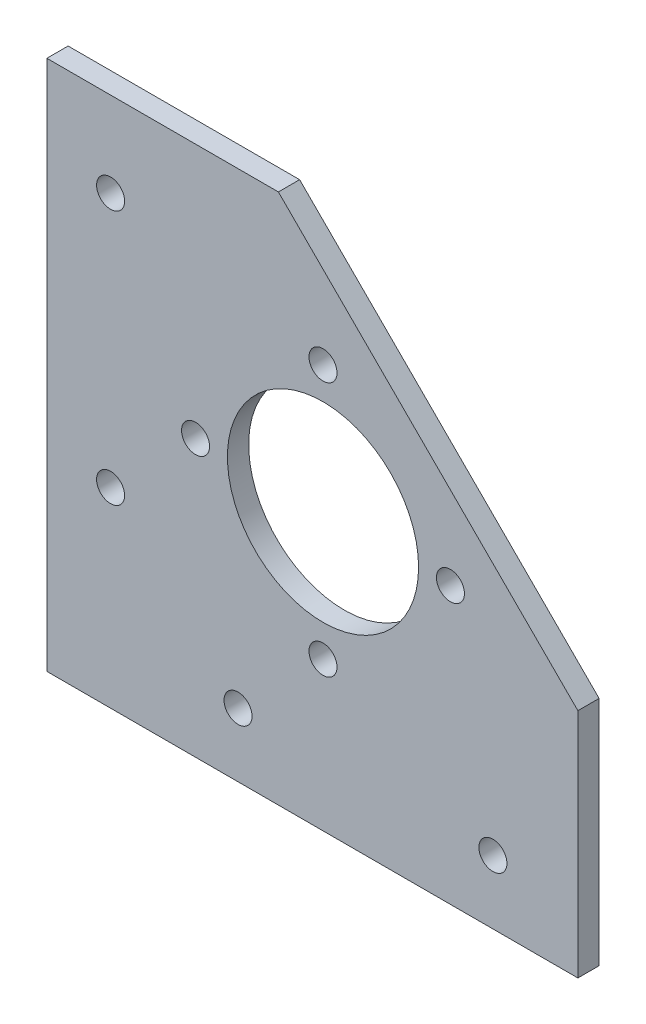
ISO-10303-21;
HEADER;
FILE_DESCRIPTION(('STEP AP214'),'2;1');
FILE_NAME('part.step','',(''),(''),'','','');
FILE_SCHEMA(('AUTOMOTIVE_DESIGN { 1 0 10303 214 1 1 1 1 }'));
ENDSEC;
DATA;
#1=APPLICATION_CONTEXT('core data for automotive mechanical design processes');
#2=APPLICATION_PROTOCOL_DEFINITION('international standard','automotive_design',2000,#1);
#3=PRODUCT_CONTEXT('',#1,'mechanical');
#4=PRODUCT('Part','Part','',(#3));
#5=PRODUCT_RELATED_PRODUCT_CATEGORY('part','',(#4));
#6=PRODUCT_DEFINITION_FORMATION('','',#4);
#7=PRODUCT_DEFINITION_CONTEXT('part definition',#1,'design');
#8=PRODUCT_DEFINITION('design','',#6,#7);
#9=PRODUCT_DEFINITION_SHAPE('','',#8);
#10=(LENGTH_UNIT() NAMED_UNIT(*) SI_UNIT(.MILLI.,.METRE.));
#11=(NAMED_UNIT(*) PLANE_ANGLE_UNIT() SI_UNIT($,.RADIAN.));
#12=(NAMED_UNIT(*) SI_UNIT($,.STERADIAN.) SOLID_ANGLE_UNIT());
#13=UNCERTAINTY_MEASURE_WITH_UNIT(LENGTH_MEASURE(1.E-05),#10,'distance_accuracy_value','');
#14=(GEOMETRIC_REPRESENTATION_CONTEXT(3) GLOBAL_UNCERTAINTY_ASSIGNED_CONTEXT((#13)) GLOBAL_UNIT_ASSIGNED_CONTEXT((#10,
#11,#12)) REPRESENTATION_CONTEXT('',''));
#15=CARTESIAN_POINT('',(0.,0.,0.));
#16=DIRECTION('',(0.,0.,1.));
#17=DIRECTION('',(1.,0.,0.));
#18=AXIS2_PLACEMENT_3D('',#15,#16,#17);
#19=CARTESIAN_POINT('',(125.,-75.1414213562373,5.));
#20=DIRECTION('',(1.,0.,0.));
#21=DIRECTION('',(0.,0.,-1.));
#22=AXIS2_PLACEMENT_3D('',#19,#20,#21);
#23=PLANE('',#22);
#24=DIRECTION('',(0.,-1.,0.));
#25=VECTOR('',#24,1.);
#26=CARTESIAN_POINT('',(125.,-75.1414213562373,0.));
#27=LINE('',#26,#25);
#28=CARTESIAN_POINT('',(125.,54.4974746830583,0.));
#29=VERTEX_POINT('',#28);
#30=CARTESIAN_POINT('',(125.,0.,0.));
#31=VERTEX_POINT('',#30);
#32=EDGE_CURVE('E115',#29,#31,#27,.T.);
#33=ORIENTED_EDGE('',*,*,#32,.F.);
#34=DIRECTION('',(0.,0.,-1.));
#35=VECTOR('',#34,1.);
#36=CARTESIAN_POINT('',(125.,54.4974746830583,5.));
#37=LINE('',#36,#35);
#38=CARTESIAN_POINT('',(125.,54.4974746830583,5.));
#39=VERTEX_POINT('',#38);
#40=EDGE_CURVE('E11',#39,#29,#37,.T.);
#41=ORIENTED_EDGE('',*,*,#40,.F.);
#42=DIRECTION('',(0.,-1.,0.));
#43=VECTOR('',#42,1.);
#44=CARTESIAN_POINT('',(125.,-75.1414213562373,5.));
#45=LINE('',#44,#43);
#46=CARTESIAN_POINT('',(125.,0.,5.));
#47=VERTEX_POINT('',#46);
#48=EDGE_CURVE('E317',#39,#47,#45,.T.);
#49=ORIENTED_EDGE('',*,*,#48,.T.);
#50=DIRECTION('',(0.,0.,-1.));
#51=VECTOR('',#50,1.);
#52=CARTESIAN_POINT('',(125.,0.,5.));
#53=LINE('',#52,#51);
#54=EDGE_CURVE('E55',#47,#31,#53,.T.);
#55=ORIENTED_EDGE('',*,*,#54,.T.);
#56=EDGE_LOOP('',(#33,#41,#49,#55));
#57=FACE_BOUND('',#56,.T.);
#58=ADVANCED_FACE('F38',(#57),#23,.T.);
#59=CARTESIAN_POINT('',(158.569448019648,20.9280266634105,5.));
#60=DIRECTION('',(0.707106781186548,0.707106781186548,0.));
#61=DIRECTION('',(-0.707106781186548,0.707106781186548,0.));
#62=AXIS2_PLACEMENT_3D('',#59,#60,#61);
#63=PLANE('',#62);
#64=DIRECTION('',(0.707106781186548,-0.707106781186548,0.));
#65=VECTOR('',#64,1.);
#66=CARTESIAN_POINT('',(158.569448019648,20.9280266634105,0.));
#67=LINE('',#66,#65);
#68=CARTESIAN_POINT('',(54.4974746830583,125.,0.));
#69=VERTEX_POINT('',#68);
#70=EDGE_CURVE('E118',#69,#29,#67,.T.);
#71=ORIENTED_EDGE('',*,*,#70,.F.);
#72=DIRECTION('',(0.,0.,-1.));
#73=VECTOR('',#72,1.);
#74=CARTESIAN_POINT('',(54.4974746830583,125.,5.));
#75=LINE('',#74,#73);
#76=CARTESIAN_POINT('',(54.4974746830583,125.,5.));
#77=VERTEX_POINT('',#76);
#78=EDGE_CURVE('E47',#77,#69,#75,.T.);
#79=ORIENTED_EDGE('',*,*,#78,.F.);
#80=DIRECTION('',(0.707106781186548,-0.707106781186548,0.));
#81=VECTOR('',#80,1.);
#82=CARTESIAN_POINT('',(158.569448019648,20.9280266634105,5.));
#83=LINE('',#82,#81);
#84=EDGE_CURVE('E104',#77,#39,#83,.T.);
#85=ORIENTED_EDGE('',*,*,#84,.T.);
#86=ORIENTED_EDGE('',*,*,#40,.T.);
#87=EDGE_LOOP('',(#71,#79,#85,#86));
#88=FACE_BOUND('',#87,.T.);
#89=ADVANCED_FACE('F131',(#88),#63,.T.);
#90=CARTESIAN_POINT('',(62.5,125.,5.));
#91=DIRECTION('',(0.,1.,0.));
#92=DIRECTION('',(0.,0.,1.));
#93=AXIS2_PLACEMENT_3D('',#90,#91,#92);
#94=PLANE('',#93);
#95=DIRECTION('',(1.,0.,0.));
#96=VECTOR('',#95,1.);
#97=CARTESIAN_POINT('',(62.5,125.,0.));
#98=LINE('',#97,#96);
#99=CARTESIAN_POINT('',(0.,125.,0.));
#100=VERTEX_POINT('',#99);
#101=EDGE_CURVE('E92',#100,#69,#98,.T.);
#102=ORIENTED_EDGE('',*,*,#101,.F.);
#103=DIRECTION('',(0.,0.,-1.));
#104=VECTOR('',#103,1.);
#105=CARTESIAN_POINT('',(0.,125.,5.));
#106=LINE('',#105,#104);
#107=CARTESIAN_POINT('',(0.,125.,5.));
#108=VERTEX_POINT('',#107);
#109=EDGE_CURVE('E87',#108,#100,#106,.T.);
#110=ORIENTED_EDGE('',*,*,#109,.F.);
#111=DIRECTION('',(1.,0.,0.));
#112=VECTOR('',#111,1.);
#113=CARTESIAN_POINT('',(62.5,125.,5.));
#114=LINE('',#113,#112);
#115=EDGE_CURVE('E90',#108,#77,#114,.T.);
#116=ORIENTED_EDGE('',*,*,#115,.T.);
#117=ORIENTED_EDGE('',*,*,#78,.T.);
#118=EDGE_LOOP('',(#102,#110,#116,#117));
#119=FACE_BOUND('',#118,.T.);
#120=ADVANCED_FACE('F89',(#119),#94,.T.);
#121=CARTESIAN_POINT('',(0.,-75.1414213562373,5.));
#122=DIRECTION('',(-1.,0.,0.));
#123=DIRECTION('',(0.,0.,1.));
#124=AXIS2_PLACEMENT_3D('',#121,#122,#123);
#125=PLANE('',#124);
#126=DIRECTION('',(0.,1.,0.));
#127=VECTOR('',#126,1.);
#128=CARTESIAN_POINT('',(0.,-75.1414213562373,0.));
#129=LINE('',#128,#127);
#130=CARTESIAN_POINT('',(0.,0.,0.));
#131=VERTEX_POINT('',#130);
#132=EDGE_CURVE('E122',#131,#100,#129,.T.);
#133=ORIENTED_EDGE('',*,*,#132,.F.);
#134=DIRECTION('',(0.,0.,-1.));
#135=VECTOR('',#134,1.);
#136=CARTESIAN_POINT('',(0.,0.,5.));
#137=LINE('',#136,#135);
#138=CARTESIAN_POINT('',(0.,0.,5.));
#139=VERTEX_POINT('',#138);
#140=EDGE_CURVE('E71',#139,#131,#137,.T.);
#141=ORIENTED_EDGE('',*,*,#140,.F.);
#142=DIRECTION('',(0.,1.,0.));
#143=VECTOR('',#142,1.);
#144=CARTESIAN_POINT('',(0.,-75.1414213562373,5.));
#145=LINE('',#144,#143);
#146=EDGE_CURVE('E102',#139,#108,#145,.T.);
#147=ORIENTED_EDGE('',*,*,#146,.T.);
#148=ORIENTED_EDGE('',*,*,#109,.T.);
#149=EDGE_LOOP('',(#133,#141,#147,#148));
#150=FACE_BOUND('',#149,.T.);
#151=ADVANCED_FACE('F106',(#150),#125,.T.);
#152=CARTESIAN_POINT('',(65.,65.,5.));
#153=DIRECTION('',(0.,0.,-1.));
#154=DIRECTION('',(-1.,0.,0.));
#155=AXIS2_PLACEMENT_3D('',#152,#153,#154);
#156=CYLINDRICAL_SURFACE('',#155,22.5);
#157=CARTESIAN_POINT('',(65.,65.,5.));
#158=DIRECTION('',(0.,0.,1.));
#159=DIRECTION('',(1.,0.,0.));
#160=AXIS2_PLACEMENT_3D('',#157,#158,#159);
#161=CIRCLE('',#160,22.5);
#162=CARTESIAN_POINT('',(87.5,65.,5.));
#163=VERTEX_POINT('',#162);
#164=EDGE_CURVE('E127',#163,#163,#161,.T.);
#165=ORIENTED_EDGE('',*,*,#164,.T.);
#166=EDGE_LOOP('',(#165));
#167=FACE_BOUND('',#166,.T.);
#168=CARTESIAN_POINT('',(65.,65.,0.));
#169=DIRECTION('',(0.,0.,1.));
#170=DIRECTION('',(1.,0.,0.));
#171=AXIS2_PLACEMENT_3D('',#168,#169,#170);
#172=CIRCLE('',#171,22.5);
#173=CARTESIAN_POINT('',(87.5,65.,0.));
#174=VERTEX_POINT('',#173);
#175=EDGE_CURVE('E112',#174,#174,#172,.T.);
#176=ORIENTED_EDGE('',*,*,#175,.F.);
#177=EDGE_LOOP('',(#176));
#178=FACE_BOUND('',#177,.T.);
#179=ADVANCED_FACE('F40',(#167,#178),#156,.F.);
#180=CARTESIAN_POINT('',(62.5,0.,5.));
#181=DIRECTION('',(0.,-1.,0.));
#182=DIRECTION('',(0.,0.,-1.));
#183=AXIS2_PLACEMENT_3D('',#180,#181,#182);
#184=PLANE('',#183);
#185=DIRECTION('',(-1.,0.,0.));
#186=VECTOR('',#185,1.);
#187=CARTESIAN_POINT('',(62.5,0.,0.));
#188=LINE('',#187,#186);
#189=EDGE_CURVE('E124',#31,#131,#188,.T.);
#190=ORIENTED_EDGE('',*,*,#189,.F.);
#191=ORIENTED_EDGE('',*,*,#54,.F.);
#192=DIRECTION('',(-1.,0.,0.));
#193=VECTOR('',#192,1.);
#194=CARTESIAN_POINT('',(62.5,0.,5.));
#195=LINE('',#194,#193);
#196=EDGE_CURVE('E107',#47,#139,#195,.T.);
#197=ORIENTED_EDGE('',*,*,#196,.T.);
#198=ORIENTED_EDGE('',*,*,#140,.T.);
#199=EDGE_LOOP('',(#190,#191,#197,#198));
#200=FACE_BOUND('',#199,.T.);
#201=ADVANCED_FACE('F134',(#200),#184,.T.);
#202=CARTESIAN_POINT('',(62.5,-75.1414213562373,5.));
#203=DIRECTION('',(0.,0.,1.));
#204=DIRECTION('',(1.,0.,0.));
#205=AXIS2_PLACEMENT_3D('',#202,#203,#204);
#206=PLANE('',#205);
#207=CARTESIAN_POINT('',(95.,65.,5.));
#208=DIRECTION('',(0.,0.,1.));
#209=DIRECTION('',(1.,0.,0.));
#210=AXIS2_PLACEMENT_3D('',#207,#208,#209);
#211=CIRCLE('',#210,3.3);
#212=CARTESIAN_POINT('',(98.3,65.,5.));
#213=VERTEX_POINT('',#212);
#214=EDGE_CURVE('E267',#213,#213,#211,.T.);
#215=ORIENTED_EDGE('',*,*,#214,.F.);
#216=EDGE_LOOP('',(#215));
#217=FACE_BOUND('',#216,.T.);
#218=CARTESIAN_POINT('',(65.,95.,5.));
#219=DIRECTION('',(0.,0.,1.));
#220=DIRECTION('',(1.,0.,0.));
#221=AXIS2_PLACEMENT_3D('',#218,#219,#220);
#222=CIRCLE('',#221,3.3);
#223=CARTESIAN_POINT('',(68.3,95.,5.));
#224=VERTEX_POINT('',#223);
#225=EDGE_CURVE('E277',#224,#224,#222,.T.);
#226=ORIENTED_EDGE('',*,*,#225,.F.);
#227=EDGE_LOOP('',(#226));
#228=FACE_BOUND('',#227,.T.);
#229=CARTESIAN_POINT('',(35.,65.,5.));
#230=DIRECTION('',(0.,0.,1.));
#231=DIRECTION('',(1.,0.,0.));
#232=AXIS2_PLACEMENT_3D('',#229,#230,#231);
#233=CIRCLE('',#232,3.3);
#234=CARTESIAN_POINT('',(38.3,65.,5.));
#235=VERTEX_POINT('',#234);
#236=EDGE_CURVE('E283',#235,#235,#233,.T.);
#237=ORIENTED_EDGE('',*,*,#236,.F.);
#238=EDGE_LOOP('',(#237));
#239=FACE_BOUND('',#238,.T.);
#240=CARTESIAN_POINT('',(65.,35.,5.));
#241=DIRECTION('',(0.,0.,1.));
#242=DIRECTION('',(1.,0.,0.));
#243=AXIS2_PLACEMENT_3D('',#240,#241,#242);
#244=CIRCLE('',#243,3.3);
#245=CARTESIAN_POINT('',(68.3,35.,5.));
#246=VERTEX_POINT('',#245);
#247=EDGE_CURVE('E289',#246,#246,#244,.T.);
#248=ORIENTED_EDGE('',*,*,#247,.F.);
#249=EDGE_LOOP('',(#248));
#250=FACE_BOUND('',#249,.T.);
#251=CARTESIAN_POINT('',(105.,15.,5.));
#252=DIRECTION('',(0.,0.,1.));
#253=DIRECTION('',(1.,0.,0.));
#254=AXIS2_PLACEMENT_3D('',#251,#252,#253);
#255=CIRCLE('',#254,3.3);
#256=CARTESIAN_POINT('',(108.3,15.,5.));
#257=VERTEX_POINT('',#256);
#258=EDGE_CURVE('E295',#257,#257,#255,.T.);
#259=ORIENTED_EDGE('',*,*,#258,.F.);
#260=EDGE_LOOP('',(#259));
#261=FACE_BOUND('',#260,.T.);
#262=CARTESIAN_POINT('',(45.,15.,5.));
#263=DIRECTION('',(0.,0.,1.));
#264=DIRECTION('',(1.,0.,0.));
#265=AXIS2_PLACEMENT_3D('',#262,#263,#264);
#266=CIRCLE('',#265,3.3);
#267=CARTESIAN_POINT('',(48.3,15.,5.));
#268=VERTEX_POINT('',#267);
#269=EDGE_CURVE('E301',#268,#268,#266,.T.);
#270=ORIENTED_EDGE('',*,*,#269,.F.);
#271=EDGE_LOOP('',(#270));
#272=FACE_BOUND('',#271,.T.);
#273=CARTESIAN_POINT('',(15.,45.,5.));
#274=DIRECTION('',(0.,0.,1.));
#275=DIRECTION('',(1.,0.,0.));
#276=AXIS2_PLACEMENT_3D('',#273,#274,#275);
#277=CIRCLE('',#276,3.3);
#278=CARTESIAN_POINT('',(18.3,45.,5.));
#279=VERTEX_POINT('',#278);
#280=EDGE_CURVE('E307',#279,#279,#277,.T.);
#281=ORIENTED_EDGE('',*,*,#280,.F.);
#282=EDGE_LOOP('',(#281));
#283=FACE_BOUND('',#282,.T.);
#284=CARTESIAN_POINT('',(15.,105.,5.));
#285=DIRECTION('',(0.,0.,1.));
#286=DIRECTION('',(1.,0.,0.));
#287=AXIS2_PLACEMENT_3D('',#284,#285,#286);
#288=CIRCLE('',#287,3.3);
#289=CARTESIAN_POINT('',(18.3,105.,5.));
#290=VERTEX_POINT('',#289);
#291=EDGE_CURVE('E116',#290,#290,#288,.T.);
#292=ORIENTED_EDGE('',*,*,#291,.F.);
#293=EDGE_LOOP('',(#292));
#294=FACE_BOUND('',#293,.T.);
#295=ORIENTED_EDGE('',*,*,#164,.F.);
#296=EDGE_LOOP('',(#295));
#297=FACE_BOUND('',#296,.T.);
#298=ORIENTED_EDGE('',*,*,#48,.F.);
#299=ORIENTED_EDGE('',*,*,#84,.F.);
#300=ORIENTED_EDGE('',*,*,#115,.F.);
#301=ORIENTED_EDGE('',*,*,#146,.F.);
#302=ORIENTED_EDGE('',*,*,#196,.F.);
#303=EDGE_LOOP('',(#298,#299,#300,#301,#302));
#304=FACE_BOUND('',#303,.T.);
#305=ADVANCED_FACE('F100',(#217,#228,#239,#250,#261,#272,#283,#294,#297,#304),#206,.T.);
#306=CARTESIAN_POINT('',(62.5,-75.1414213562373,0.));
#307=DIRECTION('',(0.,0.,1.));
#308=DIRECTION('',(1.,0.,0.));
#309=AXIS2_PLACEMENT_3D('',#306,#307,#308);
#310=PLANE('',#309);
#311=CARTESIAN_POINT('',(95.,65.,0.));
#312=DIRECTION('',(0.,0.,-1.));
#313=DIRECTION('',(-1.,0.,0.));
#314=AXIS2_PLACEMENT_3D('',#311,#312,#313);
#315=CIRCLE('',#314,3.3);
#316=CARTESIAN_POINT('',(91.7,65.,0.));
#317=VERTEX_POINT('',#316);
#318=EDGE_CURVE('E270',#317,#317,#315,.T.);
#319=ORIENTED_EDGE('',*,*,#318,.F.);
#320=EDGE_LOOP('',(#319));
#321=FACE_BOUND('',#320,.T.);
#322=CARTESIAN_POINT('',(65.,95.,0.));
#323=DIRECTION('',(0.,0.,-1.));
#324=DIRECTION('',(-1.,0.,0.));
#325=AXIS2_PLACEMENT_3D('',#322,#323,#324);
#326=CIRCLE('',#325,3.3);
#327=CARTESIAN_POINT('',(61.7,95.,0.));
#328=VERTEX_POINT('',#327);
#329=EDGE_CURVE('E272',#328,#328,#326,.T.);
#330=ORIENTED_EDGE('',*,*,#329,.F.);
#331=EDGE_LOOP('',(#330));
#332=FACE_BOUND('',#331,.T.);
#333=CARTESIAN_POINT('',(35.,65.,0.));
#334=DIRECTION('',(0.,0.,-1.));
#335=DIRECTION('',(-1.,0.,0.));
#336=AXIS2_PLACEMENT_3D('',#333,#334,#335);
#337=CIRCLE('',#336,3.3);
#338=CARTESIAN_POINT('',(31.7,65.,0.));
#339=VERTEX_POINT('',#338);
#340=EDGE_CURVE('E280',#339,#339,#337,.T.);
#341=ORIENTED_EDGE('',*,*,#340,.F.);
#342=EDGE_LOOP('',(#341));
#343=FACE_BOUND('',#342,.T.);
#344=CARTESIAN_POINT('',(65.,35.,0.));
#345=DIRECTION('',(0.,0.,-1.));
#346=DIRECTION('',(-1.,0.,0.));
#347=AXIS2_PLACEMENT_3D('',#344,#345,#346);
#348=CIRCLE('',#347,3.3);
#349=CARTESIAN_POINT('',(61.7,35.,0.));
#350=VERTEX_POINT('',#349);
#351=EDGE_CURVE('E286',#350,#350,#348,.T.);
#352=ORIENTED_EDGE('',*,*,#351,.F.);
#353=EDGE_LOOP('',(#352));
#354=FACE_BOUND('',#353,.T.);
#355=CARTESIAN_POINT('',(105.,15.,0.));
#356=DIRECTION('',(0.,0.,-1.));
#357=DIRECTION('',(-1.,0.,0.));
#358=AXIS2_PLACEMENT_3D('',#355,#356,#357);
#359=CIRCLE('',#358,3.3);
#360=CARTESIAN_POINT('',(101.7,15.,0.));
#361=VERTEX_POINT('',#360);
#362=EDGE_CURVE('E292',#361,#361,#359,.T.);
#363=ORIENTED_EDGE('',*,*,#362,.F.);
#364=EDGE_LOOP('',(#363));
#365=FACE_BOUND('',#364,.T.);
#366=CARTESIAN_POINT('',(45.,15.,0.));
#367=DIRECTION('',(0.,0.,-1.));
#368=DIRECTION('',(-1.,0.,0.));
#369=AXIS2_PLACEMENT_3D('',#366,#367,#368);
#370=CIRCLE('',#369,3.3);
#371=CARTESIAN_POINT('',(41.7,15.,0.));
#372=VERTEX_POINT('',#371);
#373=EDGE_CURVE('E298',#372,#372,#370,.T.);
#374=ORIENTED_EDGE('',*,*,#373,.F.);
#375=EDGE_LOOP('',(#374));
#376=FACE_BOUND('',#375,.T.);
#377=CARTESIAN_POINT('',(15.,45.,0.));
#378=DIRECTION('',(0.,0.,-1.));
#379=DIRECTION('',(-1.,0.,0.));
#380=AXIS2_PLACEMENT_3D('',#377,#378,#379);
#381=CIRCLE('',#380,3.3);
#382=CARTESIAN_POINT('',(11.7,45.,0.));
#383=VERTEX_POINT('',#382);
#384=EDGE_CURVE('E304',#383,#383,#381,.T.);
#385=ORIENTED_EDGE('',*,*,#384,.F.);
#386=EDGE_LOOP('',(#385));
#387=FACE_BOUND('',#386,.T.);
#388=CARTESIAN_POINT('',(15.,105.,0.));
#389=DIRECTION('',(0.,0.,-1.));
#390=DIRECTION('',(-1.,0.,0.));
#391=AXIS2_PLACEMENT_3D('',#388,#389,#390);
#392=CIRCLE('',#391,3.3);
#393=CARTESIAN_POINT('',(11.7,105.,0.));
#394=VERTEX_POINT('',#393);
#395=EDGE_CURVE('E310',#394,#394,#392,.T.);
#396=ORIENTED_EDGE('',*,*,#395,.F.);
#397=EDGE_LOOP('',(#396));
#398=FACE_BOUND('',#397,.T.);
#399=ORIENTED_EDGE('',*,*,#175,.T.);
#400=EDGE_LOOP('',(#399));
#401=FACE_BOUND('',#400,.T.);
#402=ORIENTED_EDGE('',*,*,#32,.T.);
#403=ORIENTED_EDGE('',*,*,#189,.T.);
#404=ORIENTED_EDGE('',*,*,#132,.T.);
#405=ORIENTED_EDGE('',*,*,#101,.T.);
#406=ORIENTED_EDGE('',*,*,#70,.T.);
#407=EDGE_LOOP('',(#402,#403,#404,#405,#406));
#408=FACE_BOUND('',#407,.T.);
#409=ADVANCED_FACE('F133',(#321,#332,#343,#354,#365,#376,#387,#398,#401,#408),#310,.F.);
#410=CARTESIAN_POINT('',(15.,105.,0.));
#411=DIRECTION('',(0.,0.,-1.));
#412=DIRECTION('',(-1.,0.,0.));
#413=AXIS2_PLACEMENT_3D('',#410,#411,#412);
#414=CYLINDRICAL_SURFACE('',#413,3.3);
#415=ORIENTED_EDGE('',*,*,#291,.T.);
#416=EDGE_LOOP('',(#415));
#417=FACE_BOUND('',#416,.T.);
#418=ORIENTED_EDGE('',*,*,#395,.T.);
#419=EDGE_LOOP('',(#418));
#420=FACE_BOUND('',#419,.T.);
#421=ADVANCED_FACE('F181',(#417,#420),#414,.F.);
#422=CARTESIAN_POINT('',(15.,45.,0.));
#423=DIRECTION('',(0.,0.,-1.));
#424=DIRECTION('',(-1.,0.,0.));
#425=AXIS2_PLACEMENT_3D('',#422,#423,#424);
#426=CYLINDRICAL_SURFACE('',#425,3.3);
#427=ORIENTED_EDGE('',*,*,#280,.T.);
#428=EDGE_LOOP('',(#427));
#429=FACE_BOUND('',#428,.T.);
#430=ORIENTED_EDGE('',*,*,#384,.T.);
#431=EDGE_LOOP('',(#430));
#432=FACE_BOUND('',#431,.T.);
#433=ADVANCED_FACE('F190',(#429,#432),#426,.F.);
#434=CARTESIAN_POINT('',(45.,15.,0.));
#435=DIRECTION('',(0.,0.,-1.));
#436=DIRECTION('',(-1.,0.,0.));
#437=AXIS2_PLACEMENT_3D('',#434,#435,#436);
#438=CYLINDRICAL_SURFACE('',#437,3.3);
#439=ORIENTED_EDGE('',*,*,#269,.T.);
#440=EDGE_LOOP('',(#439));
#441=FACE_BOUND('',#440,.T.);
#442=ORIENTED_EDGE('',*,*,#373,.T.);
#443=EDGE_LOOP('',(#442));
#444=FACE_BOUND('',#443,.T.);
#445=ADVANCED_FACE('F200',(#441,#444),#438,.F.);
#446=CARTESIAN_POINT('',(105.,15.,0.));
#447=DIRECTION('',(0.,0.,-1.));
#448=DIRECTION('',(-1.,0.,0.));
#449=AXIS2_PLACEMENT_3D('',#446,#447,#448);
#450=CYLINDRICAL_SURFACE('',#449,3.3);
#451=ORIENTED_EDGE('',*,*,#258,.T.);
#452=EDGE_LOOP('',(#451));
#453=FACE_BOUND('',#452,.T.);
#454=ORIENTED_EDGE('',*,*,#362,.T.);
#455=EDGE_LOOP('',(#454));
#456=FACE_BOUND('',#455,.T.);
#457=ADVANCED_FACE('F210',(#453,#456),#450,.F.);
#458=CARTESIAN_POINT('',(65.,35.,0.));
#459=DIRECTION('',(0.,0.,-1.));
#460=DIRECTION('',(-1.,0.,0.));
#461=AXIS2_PLACEMENT_3D('',#458,#459,#460);
#462=CYLINDRICAL_SURFACE('',#461,3.3);
#463=ORIENTED_EDGE('',*,*,#247,.T.);
#464=EDGE_LOOP('',(#463));
#465=FACE_BOUND('',#464,.T.);
#466=ORIENTED_EDGE('',*,*,#351,.T.);
#467=EDGE_LOOP('',(#466));
#468=FACE_BOUND('',#467,.T.);
#469=ADVANCED_FACE('F220',(#465,#468),#462,.F.);
#470=CARTESIAN_POINT('',(35.,65.,0.));
#471=DIRECTION('',(0.,0.,-1.));
#472=DIRECTION('',(-1.,0.,0.));
#473=AXIS2_PLACEMENT_3D('',#470,#471,#472);
#474=CYLINDRICAL_SURFACE('',#473,3.3);
#475=ORIENTED_EDGE('',*,*,#236,.T.);
#476=EDGE_LOOP('',(#475));
#477=FACE_BOUND('',#476,.T.);
#478=ORIENTED_EDGE('',*,*,#340,.T.);
#479=EDGE_LOOP('',(#478));
#480=FACE_BOUND('',#479,.T.);
#481=ADVANCED_FACE('F230',(#477,#480),#474,.F.);
#482=CARTESIAN_POINT('',(65.,95.,0.));
#483=DIRECTION('',(0.,0.,-1.));
#484=DIRECTION('',(-1.,0.,0.));
#485=AXIS2_PLACEMENT_3D('',#482,#483,#484);
#486=CYLINDRICAL_SURFACE('',#485,3.3);
#487=ORIENTED_EDGE('',*,*,#225,.T.);
#488=EDGE_LOOP('',(#487));
#489=FACE_BOUND('',#488,.T.);
#490=ORIENTED_EDGE('',*,*,#329,.T.);
#491=EDGE_LOOP('',(#490));
#492=FACE_BOUND('',#491,.T.);
#493=ADVANCED_FACE('F240',(#489,#492),#486,.F.);
#494=CARTESIAN_POINT('',(95.,65.,0.));
#495=DIRECTION('',(0.,0.,-1.));
#496=DIRECTION('',(-1.,0.,0.));
#497=AXIS2_PLACEMENT_3D('',#494,#495,#496);
#498=CYLINDRICAL_SURFACE('',#497,3.3);
#499=ORIENTED_EDGE('',*,*,#214,.T.);
#500=EDGE_LOOP('',(#499));
#501=FACE_BOUND('',#500,.T.);
#502=ORIENTED_EDGE('',*,*,#318,.T.);
#503=EDGE_LOOP('',(#502));
#504=FACE_BOUND('',#503,.T.);
#505=ADVANCED_FACE('F250',(#501,#504),#498,.F.);
#506=CLOSED_SHELL('',(#58,#89,#120,#151,#179,#201,#305,#409,#421,#433,#445,#457,#469,#481,#493,#505));
#507=MANIFOLD_SOLID_BREP('B2',#506);
#508=ADVANCED_BREP_SHAPE_REPRESENTATION('',(#18,#507),#14);
#509=SHAPE_DEFINITION_REPRESENTATION(#9,#508);
ENDSEC;
END-ISO-10303-21;
